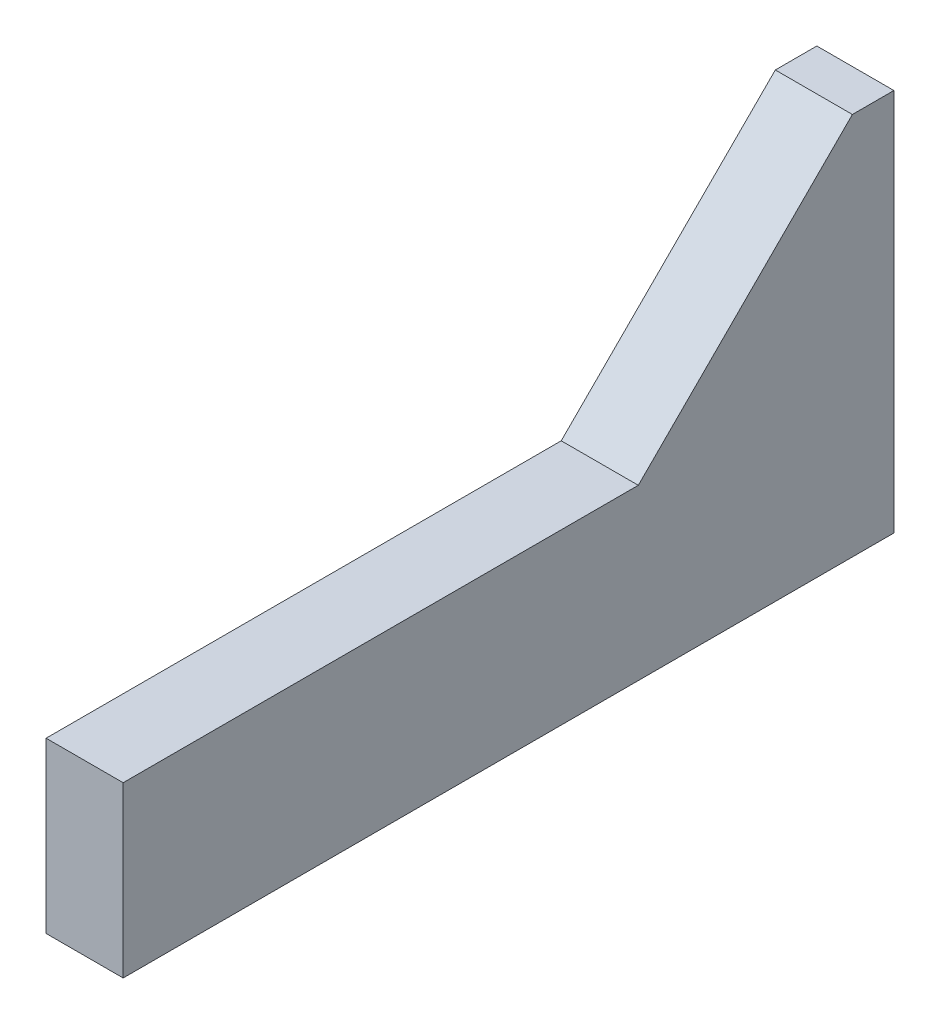
ISO-10303-21;
HEADER;
FILE_DESCRIPTION(('STEP AP214'),'2;1');
FILE_NAME('part.step','',(''),(''),'','','');
FILE_SCHEMA(('AUTOMOTIVE_DESIGN { 1 0 10303 214 1 1 1 1 }'));
ENDSEC;
DATA;
#1=APPLICATION_CONTEXT('core data for automotive mechanical design processes');
#2=APPLICATION_PROTOCOL_DEFINITION('international standard','automotive_design',2000,#1);
#3=PRODUCT_CONTEXT('',#1,'mechanical');
#4=PRODUCT('Part','Part','',(#3));
#5=PRODUCT_RELATED_PRODUCT_CATEGORY('part','',(#4));
#6=PRODUCT_DEFINITION_FORMATION('','',#4);
#7=PRODUCT_DEFINITION_CONTEXT('part definition',#1,'design');
#8=PRODUCT_DEFINITION('design','',#6,#7);
#9=PRODUCT_DEFINITION_SHAPE('','',#8);
#10=(LENGTH_UNIT() NAMED_UNIT(*) SI_UNIT(.MILLI.,.METRE.));
#11=(NAMED_UNIT(*) PLANE_ANGLE_UNIT() SI_UNIT($,.RADIAN.));
#12=(NAMED_UNIT(*) SI_UNIT($,.STERADIAN.) SOLID_ANGLE_UNIT());
#13=UNCERTAINTY_MEASURE_WITH_UNIT(LENGTH_MEASURE(1.E-05),#10,'distance_accuracy_value','');
#14=(GEOMETRIC_REPRESENTATION_CONTEXT(3) GLOBAL_UNCERTAINTY_ASSIGNED_CONTEXT((#13)) GLOBAL_UNIT_ASSIGNED_CONTEXT((#10,
#11,#12)) REPRESENTATION_CONTEXT('',''));
#15=CARTESIAN_POINT('',(0.,0.,0.));
#16=DIRECTION('',(0.,0.,1.));
#17=DIRECTION('',(1.,0.,0.));
#18=AXIS2_PLACEMENT_3D('',#15,#16,#17);
#19=CARTESIAN_POINT('',(-9.,12.25,90.));
#20=DIRECTION('',(0.,1.,0.));
#21=DIRECTION('',(0.,0.,1.));
#22=AXIS2_PLACEMENT_3D('',#19,#20,#21);
#23=PLANE('',#22);
#24=DIRECTION('',(0.,0.,-1.));
#25=VECTOR('',#24,1.);
#26=CARTESIAN_POINT('',(-13.5,12.25,90.));
#27=LINE('',#26,#25);
#28=CARTESIAN_POINT('',(-13.5,12.25,90.));
#29=VERTEX_POINT('',#28);
#30=CARTESIAN_POINT('',(-13.5,12.25,29.8478534301178));
#31=VERTEX_POINT('',#30);
#32=EDGE_CURVE('E164',#29,#31,#27,.T.);
#33=ORIENTED_EDGE('',*,*,#32,.F.);
#34=DIRECTION('',(-1.,0.,0.));
#35=VECTOR('',#34,1.);
#36=CARTESIAN_POINT('',(-9.,12.25,90.));
#37=LINE('',#36,#35);
#38=CARTESIAN_POINT('',(-4.5,12.25,90.));
#39=VERTEX_POINT('',#38);
#40=EDGE_CURVE('E235',#39,#29,#37,.T.);
#41=ORIENTED_EDGE('',*,*,#40,.F.);
#42=DIRECTION('',(0.,0.,-1.));
#43=VECTOR('',#42,1.);
#44=CARTESIAN_POINT('',(-4.5,12.25,90.));
#45=LINE('',#44,#43);
#46=CARTESIAN_POINT('',(-4.5,12.25,29.8478534301178));
#47=VERTEX_POINT('',#46);
#48=EDGE_CURVE('E160',#39,#47,#45,.T.);
#49=ORIENTED_EDGE('',*,*,#48,.T.);
#50=DIRECTION('',(1.,0.,0.));
#51=VECTOR('',#50,1.);
#52=CARTESIAN_POINT('',(-52.4344879815543,12.25,29.8478534301178));
#53=LINE('',#52,#51);
#54=EDGE_CURVE('E288',#31,#47,#53,.T.);
#55=ORIENTED_EDGE('',*,*,#54,.F.);
#56=EDGE_LOOP('',(#33,#41,#49,#55));
#57=FACE_BOUND('',#56,.T.);
#58=ADVANCED_FACE('F38',(#57),#23,.T.);
#59=CARTESIAN_POINT('',(-9.,-7.5,90.));
#60=DIRECTION('',(0.,1.,0.));
#61=DIRECTION('',(0.,0.,1.));
#62=AXIS2_PLACEMENT_3D('',#59,#60,#61);
#63=PLANE('',#62);
#64=CARTESIAN_POINT('',(-9.,-7.5,22.5));
#65=DIRECTION('',(0.,1.,0.));
#66=DIRECTION('',(0.,0.,-1.));
#67=AXIS2_PLACEMENT_3D('',#64,#65,#66);
#68=CIRCLE('',#67,2.1);
#69=CARTESIAN_POINT('',(-9.,-7.5,20.4));
#70=VERTEX_POINT('',#69);
#71=EDGE_CURVE('E220',#70,#70,#68,.T.);
#72=ORIENTED_EDGE('',*,*,#71,.T.);
#73=EDGE_LOOP('',(#72));
#74=FACE_BOUND('',#73,.T.);
#75=CARTESIAN_POINT('',(-9.,-7.5,67.5));
#76=DIRECTION('',(0.,1.,0.));
#77=DIRECTION('',(0.,0.,-1.));
#78=AXIS2_PLACEMENT_3D('',#75,#76,#77);
#79=CIRCLE('',#78,2.1);
#80=CARTESIAN_POINT('',(-9.,-7.5,65.4));
#81=VERTEX_POINT('',#80);
#82=EDGE_CURVE('E226',#81,#81,#79,.T.);
#83=ORIENTED_EDGE('',*,*,#82,.T.);
#84=EDGE_LOOP('',(#83));
#85=FACE_BOUND('',#84,.T.);
#86=CARTESIAN_POINT('',(-9.,-7.5,45.));
#87=DIRECTION('',(0.,1.,0.));
#88=DIRECTION('',(0.,0.,-1.));
#89=AXIS2_PLACEMENT_3D('',#86,#87,#88);
#90=CIRCLE('',#89,2.1);
#91=CARTESIAN_POINT('',(-9.,-7.5,42.9));
#92=VERTEX_POINT('',#91);
#93=EDGE_CURVE('E215',#92,#92,#90,.T.);
#94=ORIENTED_EDGE('',*,*,#93,.T.);
#95=EDGE_LOOP('',(#94));
#96=FACE_BOUND('',#95,.T.);
#97=DIRECTION('',(-1.,0.,0.));
#98=VECTOR('',#97,1.);
#99=CARTESIAN_POINT('',(-9.,-7.5,0.));
#100=LINE('',#99,#98);
#101=CARTESIAN_POINT('',(-4.5,-7.5,0.));
#102=VERTEX_POINT('',#101);
#103=CARTESIAN_POINT('',(-13.5,-7.5,0.));
#104=VERTEX_POINT('',#103);
#105=EDGE_CURVE('E219',#102,#104,#100,.T.);
#106=ORIENTED_EDGE('',*,*,#105,.F.);
#107=DIRECTION('',(0.,0.,-1.));
#108=VECTOR('',#107,1.);
#109=CARTESIAN_POINT('',(-4.5,-7.5,90.));
#110=LINE('',#109,#108);
#111=CARTESIAN_POINT('',(-4.5,-7.5,90.));
#112=VERTEX_POINT('',#111);
#113=EDGE_CURVE('E148',#112,#102,#110,.T.);
#114=ORIENTED_EDGE('',*,*,#113,.F.);
#115=DIRECTION('',(-1.,0.,0.));
#116=VECTOR('',#115,1.);
#117=CARTESIAN_POINT('',(-9.,-7.5,90.));
#118=LINE('',#117,#116);
#119=CARTESIAN_POINT('',(-13.5,-7.5,90.));
#120=VERTEX_POINT('',#119);
#121=EDGE_CURVE('E150',#112,#120,#118,.T.);
#122=ORIENTED_EDGE('',*,*,#121,.T.);
#123=DIRECTION('',(0.,0.,-1.));
#124=VECTOR('',#123,1.);
#125=CARTESIAN_POINT('',(-13.5,-7.5,90.));
#126=LINE('',#125,#124);
#127=EDGE_CURVE('E173',#120,#104,#126,.T.);
#128=ORIENTED_EDGE('',*,*,#127,.T.);
#129=EDGE_LOOP('',(#106,#114,#122,#128));
#130=FACE_BOUND('',#129,.T.);
#131=ADVANCED_FACE('F261',(#74,#85,#96,#130),#63,.F.);
#132=CARTESIAN_POINT('',(-9.,7.5,90.));
#133=DIRECTION('',(0.,1.,0.));
#134=DIRECTION('',(0.,0.,1.));
#135=AXIS2_PLACEMENT_3D('',#132,#133,#134);
#136=PLANE('',#135);
#137=DIRECTION('',(1.,0.,0.));
#138=VECTOR('',#137,1.);
#139=CARTESIAN_POINT('',(-13.5,7.5,87.));
#140=LINE('',#139,#138);
#141=CARTESIAN_POINT('',(-12.75,7.5,87.));
#142=VERTEX_POINT('',#141);
#143=CARTESIAN_POINT('',(-8.5,7.5,87.));
#144=VERTEX_POINT('',#143);
#145=EDGE_CURVE('E200',#142,#144,#140,.T.);
#146=ORIENTED_EDGE('',*,*,#145,.T.);
#147=DIRECTION('',(0.,0.,-1.));
#148=VECTOR('',#147,1.);
#149=CARTESIAN_POINT('',(-8.5,7.5,90.));
#150=LINE('',#149,#148);
#151=CARTESIAN_POINT('',(-8.5,7.5,0.));
#152=VERTEX_POINT('',#151);
#153=EDGE_CURVE('E170',#144,#152,#150,.T.);
#154=ORIENTED_EDGE('',*,*,#153,.T.);
#155=DIRECTION('',(-1.,0.,0.));
#156=VECTOR('',#155,1.);
#157=CARTESIAN_POINT('',(-9.,7.5,0.));
#158=LINE('',#157,#156);
#159=CARTESIAN_POINT('',(-12.75,7.5,0.));
#160=VERTEX_POINT('',#159);
#161=EDGE_CURVE('E201',#152,#160,#158,.T.);
#162=ORIENTED_EDGE('',*,*,#161,.T.);
#163=DIRECTION('',(0.,0.,-1.));
#164=VECTOR('',#163,1.);
#165=CARTESIAN_POINT('',(-12.75,7.5,0.));
#166=LINE('',#165,#164);
#167=EDGE_CURVE('E176',#142,#160,#166,.T.);
#168=ORIENTED_EDGE('',*,*,#167,.F.);
#169=EDGE_LOOP('',(#146,#154,#162,#168));
#170=FACE_BOUND('',#169,.T.);
#171=ADVANCED_FACE('F199',(#170),#136,.T.);
#172=CARTESIAN_POINT('',(-8.5,0.,90.));
#173=DIRECTION('',(1.,0.,0.));
#174=DIRECTION('',(0.,0.,1.));
#175=AXIS2_PLACEMENT_3D('',#172,#173,#174);
#176=PLANE('',#175);
#177=DIRECTION('',(0.,0.,-1.));
#178=VECTOR('',#177,1.);
#179=CARTESIAN_POINT('',(-8.5,9.75,90.));
#180=LINE('',#179,#178);
#181=CARTESIAN_POINT('',(-8.5,9.75,87.));
#182=VERTEX_POINT('',#181);
#183=CARTESIAN_POINT('',(-8.5,9.75,0.));
#184=VERTEX_POINT('',#183);
#185=EDGE_CURVE('E167',#182,#184,#180,.T.);
#186=ORIENTED_EDGE('',*,*,#185,.T.);
#187=DIRECTION('',(0.,1.,0.));
#188=VECTOR('',#187,1.);
#189=CARTESIAN_POINT('',(-8.5,0.,0.));
#190=LINE('',#189,#188);
#191=EDGE_CURVE('E244',#152,#184,#190,.T.);
#192=ORIENTED_EDGE('',*,*,#191,.F.);
#193=ORIENTED_EDGE('',*,*,#153,.F.);
#194=DIRECTION('',(0.,1.,0.));
#195=VECTOR('',#194,1.);
#196=CARTESIAN_POINT('',(-8.5,9.75,87.));
#197=LINE('',#196,#195);
#198=EDGE_CURVE('E204',#144,#182,#197,.T.);
#199=ORIENTED_EDGE('',*,*,#198,.T.);
#200=EDGE_LOOP('',(#186,#192,#193,#199));
#201=FACE_BOUND('',#200,.T.);
#202=ADVANCED_FACE('F252',(#201),#176,.F.);
#203=CARTESIAN_POINT('',(-8.99999999999999,9.75,90.));
#204=DIRECTION('',(0.,-1.,0.));
#205=DIRECTION('',(-1.,0.,0.));
#206=AXIS2_PLACEMENT_3D('',#203,#204,#205);
#207=PLANE('',#206);
#208=DIRECTION('',(1.,0.,0.));
#209=VECTOR('',#208,1.);
#210=CARTESIAN_POINT('',(-8.99999999999999,9.75,0.));
#211=LINE('',#210,#209);
#212=CARTESIAN_POINT('',(-12.75,9.75,0.));
#213=VERTEX_POINT('',#212);
#214=EDGE_CURVE('E155',#213,#184,#211,.T.);
#215=ORIENTED_EDGE('',*,*,#214,.T.);
#216=ORIENTED_EDGE('',*,*,#185,.F.);
#217=DIRECTION('',(-1.,0.,0.));
#218=VECTOR('',#217,1.);
#219=CARTESIAN_POINT('',(-13.5,9.75,87.));
#220=LINE('',#219,#218);
#221=CARTESIAN_POINT('',(-12.75,9.75,87.));
#222=VERTEX_POINT('',#221);
#223=EDGE_CURVE('E208',#182,#222,#220,.T.);
#224=ORIENTED_EDGE('',*,*,#223,.T.);
#225=DIRECTION('',(0.,0.,1.));
#226=VECTOR('',#225,1.);
#227=CARTESIAN_POINT('',(-12.75,9.75,87.));
#228=LINE('',#227,#226);
#229=EDGE_CURVE('E189',#213,#222,#228,.T.);
#230=ORIENTED_EDGE('',*,*,#229,.F.);
#231=EDGE_LOOP('',(#215,#216,#224,#230));
#232=FACE_BOUND('',#231,.T.);
#233=ADVANCED_FACE('F250',(#232),#207,.T.);
#234=CARTESIAN_POINT('',(-13.5,0.,90.));
#235=DIRECTION('',(1.,0.,0.));
#236=DIRECTION('',(0.,0.,1.));
#237=AXIS2_PLACEMENT_3D('',#234,#235,#236);
#238=PLANE('',#237);
#239=DIRECTION('',(0.,1.,0.));
#240=VECTOR('',#239,1.);
#241=CARTESIAN_POINT('',(-13.5,0.,0.));
#242=LINE('',#241,#240);
#243=CARTESIAN_POINT('',(-13.5,6.74999999999999,0.));
#244=VERTEX_POINT('',#243);
#245=EDGE_CURVE('E240',#104,#244,#242,.T.);
#246=ORIENTED_EDGE('',*,*,#245,.F.);
#247=ORIENTED_EDGE('',*,*,#127,.F.);
#248=DIRECTION('',(0.,1.,0.));
#249=VECTOR('',#248,1.);
#250=CARTESIAN_POINT('',(-13.5,0.,90.));
#251=LINE('',#250,#249);
#252=EDGE_CURVE('E153',#120,#29,#251,.T.);
#253=ORIENTED_EDGE('',*,*,#252,.T.);
#254=ORIENTED_EDGE('',*,*,#32,.T.);
#255=DIRECTION('',(0.,0.707106781186539,-0.707106781186556));
#256=VECTOR('',#255,1.);
#257=CARTESIAN_POINT('',(-13.5,37.25,4.84785343011713));
#258=LINE('',#257,#256);
#259=CARTESIAN_POINT('',(-13.5,37.25,4.84785343011713));
#260=VERTEX_POINT('',#259);
#261=EDGE_CURVE('E139',#31,#260,#258,.T.);
#262=ORIENTED_EDGE('',*,*,#261,.T.);
#263=DIRECTION('',(0.,0.,-1.));
#264=VECTOR('',#263,1.);
#265=CARTESIAN_POINT('',(-13.5,37.25,0.));
#266=LINE('',#265,#264);
#267=CARTESIAN_POINT('',(-13.5,37.25,0.));
#268=VERTEX_POINT('',#267);
#269=EDGE_CURVE('E210',#260,#268,#266,.T.);
#270=ORIENTED_EDGE('',*,*,#269,.T.);
#271=DIRECTION('',(0.,1.,0.));
#272=VECTOR('',#271,1.);
#273=CARTESIAN_POINT('',(-13.5,0.,0.));
#274=LINE('',#273,#272);
#275=CARTESIAN_POINT('',(-13.5,10.5,0.));
#276=VERTEX_POINT('',#275);
#277=EDGE_CURVE('E135',#276,#268,#274,.T.);
#278=ORIENTED_EDGE('',*,*,#277,.F.);
#279=DIRECTION('',(0.,0.,-1.));
#280=VECTOR('',#279,1.);
#281=CARTESIAN_POINT('',(-13.5,10.5,0.));
#282=LINE('',#281,#280);
#283=CARTESIAN_POINT('',(-13.5,10.5,87.));
#284=VERTEX_POINT('',#283);
#285=EDGE_CURVE('E183',#284,#276,#282,.T.);
#286=ORIENTED_EDGE('',*,*,#285,.F.);
#287=DIRECTION('',(0.,-1.,0.));
#288=VECTOR('',#287,1.);
#289=CARTESIAN_POINT('',(-13.5,9.75,87.));
#290=LINE('',#289,#288);
#291=CARTESIAN_POINT('',(-13.5,6.74999999999999,87.));
#292=VERTEX_POINT('',#291);
#293=EDGE_CURVE('E206',#284,#292,#290,.T.);
#294=ORIENTED_EDGE('',*,*,#293,.T.);
#295=DIRECTION('',(0.,0.,1.));
#296=VECTOR('',#295,1.);
#297=CARTESIAN_POINT('',(-13.5,6.74999999999999,87.));
#298=LINE('',#297,#296);
#299=EDGE_CURVE('E186',#244,#292,#298,.T.);
#300=ORIENTED_EDGE('',*,*,#299,.F.);
#301=EDGE_LOOP('',(#246,#247,#253,#254,#262,#270,#278,#286,#294,#300));
#302=FACE_BOUND('',#301,.T.);
#303=ADVANCED_FACE('F259',(#302),#238,.F.);
#304=CARTESIAN_POINT('',(-4.5,0.,90.));
#305=DIRECTION('',(1.,0.,0.));
#306=DIRECTION('',(0.,0.,1.));
#307=AXIS2_PLACEMENT_3D('',#304,#305,#306);
#308=PLANE('',#307);
#309=DIRECTION('',(0.,1.,0.));
#310=VECTOR('',#309,1.);
#311=CARTESIAN_POINT('',(-4.5,0.,0.));
#312=LINE('',#311,#310);
#313=CARTESIAN_POINT('',(-4.5,37.25,0.));
#314=VERTEX_POINT('',#313);
#315=EDGE_CURVE('E132',#102,#314,#312,.T.);
#316=ORIENTED_EDGE('',*,*,#315,.T.);
#317=DIRECTION('',(0.,0.,1.));
#318=VECTOR('',#317,1.);
#319=CARTESIAN_POINT('',(-4.5,37.25,0.));
#320=LINE('',#319,#318);
#321=CARTESIAN_POINT('',(-4.5,37.25,4.84785343011713));
#322=VERTEX_POINT('',#321);
#323=EDGE_CURVE('E142',#314,#322,#320,.T.);
#324=ORIENTED_EDGE('',*,*,#323,.T.);
#325=DIRECTION('',(0.,-0.707106781186538,0.707106781186556));
#326=VECTOR('',#325,1.);
#327=CARTESIAN_POINT('',(-4.5,37.25,4.84785343011713));
#328=LINE('',#327,#326);
#329=EDGE_CURVE('E53',#322,#47,#328,.T.);
#330=ORIENTED_EDGE('',*,*,#329,.T.);
#331=ORIENTED_EDGE('',*,*,#48,.F.);
#332=DIRECTION('',(0.,1.,0.));
#333=VECTOR('',#332,1.);
#334=CARTESIAN_POINT('',(-4.5,0.,90.));
#335=LINE('',#334,#333);
#336=EDGE_CURVE('E161',#112,#39,#335,.T.);
#337=ORIENTED_EDGE('',*,*,#336,.F.);
#338=ORIENTED_EDGE('',*,*,#113,.T.);
#339=EDGE_LOOP('',(#316,#324,#330,#331,#337,#338));
#340=FACE_BOUND('',#339,.T.);
#341=ADVANCED_FACE('F146',(#340),#308,.T.);
#342=CARTESIAN_POINT('',(-9.,0.,90.));
#343=DIRECTION('',(0.,0.,1.));
#344=DIRECTION('',(-1.,0.,0.));
#345=AXIS2_PLACEMENT_3D('',#342,#343,#344);
#346=PLANE('',#345);
#347=ORIENTED_EDGE('',*,*,#252,.F.);
#348=ORIENTED_EDGE('',*,*,#121,.F.);
#349=ORIENTED_EDGE('',*,*,#336,.T.);
#350=ORIENTED_EDGE('',*,*,#40,.T.);
#351=EDGE_LOOP('',(#347,#348,#349,#350));
#352=FACE_BOUND('',#351,.T.);
#353=ADVANCED_FACE('F280',(#352),#346,.T.);
#354=CARTESIAN_POINT('',(-9.,0.,0.));
#355=DIRECTION('',(0.,0.,1.));
#356=DIRECTION('',(-1.,0.,0.));
#357=AXIS2_PLACEMENT_3D('',#354,#355,#356);
#358=PLANE('',#357);
#359=CARTESIAN_POINT('',(-9.,2.5,0.));
#360=DIRECTION('',(0.,0.,1.));
#361=DIRECTION('',(1.,0.,0.));
#362=AXIS2_PLACEMENT_3D('',#359,#360,#361);
#363=CIRCLE('',#362,2.1);
#364=CARTESIAN_POINT('',(-6.9,2.5,0.));
#365=VERTEX_POINT('',#364);
#366=EDGE_CURVE('E302',#365,#365,#363,.T.);
#367=ORIENTED_EDGE('',*,*,#366,.T.);
#368=EDGE_LOOP('',(#367));
#369=FACE_BOUND('',#368,.T.);
#370=CARTESIAN_POINT('',(-9.,27.25,0.));
#371=DIRECTION('',(0.,0.,1.));
#372=DIRECTION('',(1.,0.,0.));
#373=AXIS2_PLACEMENT_3D('',#370,#371,#372);
#374=CIRCLE('',#373,2.1);
#375=CARTESIAN_POINT('',(-6.9,27.25,0.));
#376=VERTEX_POINT('',#375);
#377=EDGE_CURVE('E296',#376,#376,#374,.T.);
#378=ORIENTED_EDGE('',*,*,#377,.T.);
#379=EDGE_LOOP('',(#378));
#380=FACE_BOUND('',#379,.T.);
#381=ORIENTED_EDGE('',*,*,#161,.F.);
#382=ORIENTED_EDGE('',*,*,#191,.T.);
#383=ORIENTED_EDGE('',*,*,#214,.F.);
#384=DIRECTION('',(0.707106781186552,-0.707106781186543,0.));
#385=VECTOR('',#384,1.);
#386=CARTESIAN_POINT('',(-13.5,10.5,0.));
#387=LINE('',#386,#385);
#388=EDGE_CURVE('E179',#276,#213,#387,.T.);
#389=ORIENTED_EDGE('',*,*,#388,.F.);
#390=ORIENTED_EDGE('',*,*,#277,.T.);
#391=DIRECTION('',(1.,0.,0.));
#392=VECTOR('',#391,1.);
#393=CARTESIAN_POINT('',(-52.4344879815543,37.25,0.));
#394=LINE('',#393,#392);
#395=EDGE_CURVE('E126',#268,#314,#394,.T.);
#396=ORIENTED_EDGE('',*,*,#395,.T.);
#397=ORIENTED_EDGE('',*,*,#315,.F.);
#398=ORIENTED_EDGE('',*,*,#105,.T.);
#399=ORIENTED_EDGE('',*,*,#245,.T.);
#400=DIRECTION('',(-0.707106781186544,-0.707106781186551,0.));
#401=VECTOR('',#400,1.);
#402=CARTESIAN_POINT('',(-12.75,7.5,0.));
#403=LINE('',#402,#401);
#404=EDGE_CURVE('E181',#160,#244,#403,.T.);
#405=ORIENTED_EDGE('',*,*,#404,.F.);
#406=EDGE_LOOP('',(#381,#382,#383,#389,#390,#396,#397,#398,#399,#405));
#407=FACE_BOUND('',#406,.T.);
#408=ADVANCED_FACE('F129',(#369,#380,#407),#358,.F.);
#409=CARTESIAN_POINT('',(-9.,-1.5,45.));
#410=DIRECTION('',(0.,-1.,0.));
#411=DIRECTION('',(0.,0.,-1.));
#412=AXIS2_PLACEMENT_3D('',#409,#410,#411);
#413=CYLINDRICAL_SURFACE('',#412,2.1);
#414=CARTESIAN_POINT('',(-9.,-1.5,45.));
#415=DIRECTION('',(0.,1.,0.));
#416=DIRECTION('',(0.,0.,-1.));
#417=AXIS2_PLACEMENT_3D('',#414,#415,#416);
#418=CIRCLE('',#417,2.1);
#419=CARTESIAN_POINT('',(-9.,-1.5,42.9));
#420=VERTEX_POINT('',#419);
#421=EDGE_CURVE('E229',#420,#420,#418,.T.);
#422=ORIENTED_EDGE('',*,*,#421,.T.);
#423=EDGE_LOOP('',(#422));
#424=FACE_BOUND('',#423,.T.);
#425=ORIENTED_EDGE('',*,*,#93,.F.);
#426=EDGE_LOOP('',(#425));
#427=FACE_BOUND('',#426,.T.);
#428=ADVANCED_FACE('F353',(#424,#427),#413,.F.);
#429=CARTESIAN_POINT('',(-9.,-1.5,45.));
#430=DIRECTION('',(0.,-1.,0.));
#431=DIRECTION('',(0.,0.,-1.));
#432=AXIS2_PLACEMENT_3D('',#429,#430,#431);
#433=PLANE('',#432);
#434=ORIENTED_EDGE('',*,*,#421,.F.);
#435=EDGE_LOOP('',(#434));
#436=FACE_BOUND('',#435,.T.);
#437=ADVANCED_FACE('F349',(#436),#433,.T.);
#438=CARTESIAN_POINT('',(-9.,-1.5,67.5));
#439=DIRECTION('',(0.,-1.,0.));
#440=DIRECTION('',(0.,0.,-1.));
#441=AXIS2_PLACEMENT_3D('',#438,#439,#440);
#442=CYLINDRICAL_SURFACE('',#441,2.1);
#443=CARTESIAN_POINT('',(-9.,-1.5,67.5));
#444=DIRECTION('',(0.,1.,0.));
#445=DIRECTION('',(0.,0.,-1.));
#446=AXIS2_PLACEMENT_3D('',#443,#444,#445);
#447=CIRCLE('',#446,2.1);
#448=CARTESIAN_POINT('',(-9.,-1.5,65.4));
#449=VERTEX_POINT('',#448);
#450=EDGE_CURVE('E223',#449,#449,#447,.T.);
#451=ORIENTED_EDGE('',*,*,#450,.T.);
#452=EDGE_LOOP('',(#451));
#453=FACE_BOUND('',#452,.T.);
#454=ORIENTED_EDGE('',*,*,#82,.F.);
#455=EDGE_LOOP('',(#454));
#456=FACE_BOUND('',#455,.T.);
#457=ADVANCED_FACE('F345',(#453,#456),#442,.F.);
#458=CARTESIAN_POINT('',(-9.,-1.5,67.5));
#459=DIRECTION('',(0.,-1.,0.));
#460=DIRECTION('',(0.,0.,-1.));
#461=AXIS2_PLACEMENT_3D('',#458,#459,#460);
#462=PLANE('',#461);
#463=ORIENTED_EDGE('',*,*,#450,.F.);
#464=EDGE_LOOP('',(#463));
#465=FACE_BOUND('',#464,.T.);
#466=ADVANCED_FACE('F341',(#465),#462,.T.);
#467=CARTESIAN_POINT('',(-9.,-1.5,22.5));
#468=DIRECTION('',(0.,-1.,0.));
#469=DIRECTION('',(0.,0.,-1.));
#470=AXIS2_PLACEMENT_3D('',#467,#468,#469);
#471=CYLINDRICAL_SURFACE('',#470,2.1);
#472=CARTESIAN_POINT('',(-9.,-1.5,22.5));
#473=DIRECTION('',(0.,1.,0.));
#474=DIRECTION('',(0.,0.,-1.));
#475=AXIS2_PLACEMENT_3D('',#472,#473,#474);
#476=CIRCLE('',#475,2.1);
#477=CARTESIAN_POINT('',(-9.,-1.5,20.4));
#478=VERTEX_POINT('',#477);
#479=EDGE_CURVE('E216',#478,#478,#476,.T.);
#480=ORIENTED_EDGE('',*,*,#479,.T.);
#481=EDGE_LOOP('',(#480));
#482=FACE_BOUND('',#481,.T.);
#483=ORIENTED_EDGE('',*,*,#71,.F.);
#484=EDGE_LOOP('',(#483));
#485=FACE_BOUND('',#484,.T.);
#486=ADVANCED_FACE('F337',(#482,#485),#471,.F.);
#487=CARTESIAN_POINT('',(-9.,-1.5,22.5));
#488=DIRECTION('',(0.,-1.,0.));
#489=DIRECTION('',(0.,0.,-1.));
#490=AXIS2_PLACEMENT_3D('',#487,#488,#489);
#491=PLANE('',#490);
#492=ORIENTED_EDGE('',*,*,#479,.F.);
#493=EDGE_LOOP('',(#492));
#494=FACE_BOUND('',#493,.T.);
#495=ADVANCED_FACE('F334',(#494),#491,.T.);
#496=CARTESIAN_POINT('',(-9.,0.,87.));
#497=DIRECTION('',(0.,0.,-1.));
#498=DIRECTION('',(1.,0.,0.));
#499=AXIS2_PLACEMENT_3D('',#496,#497,#498);
#500=PLANE('',#499);
#501=ORIENTED_EDGE('',*,*,#293,.F.);
#502=DIRECTION('',(-0.707106781186552,0.707106781186543,0.));
#503=VECTOR('',#502,1.);
#504=CARTESIAN_POINT('',(-13.5,10.5,87.));
#505=LINE('',#504,#503);
#506=EDGE_CURVE('E11',#222,#284,#505,.T.);
#507=ORIENTED_EDGE('',*,*,#506,.F.);
#508=ORIENTED_EDGE('',*,*,#223,.F.);
#509=ORIENTED_EDGE('',*,*,#198,.F.);
#510=ORIENTED_EDGE('',*,*,#145,.F.);
#511=DIRECTION('',(0.707106781186544,0.707106781186551,0.));
#512=VECTOR('',#511,1.);
#513=CARTESIAN_POINT('',(-12.75,7.5,87.));
#514=LINE('',#513,#512);
#515=EDGE_CURVE('E46',#292,#142,#514,.T.);
#516=ORIENTED_EDGE('',*,*,#515,.F.);
#517=EDGE_LOOP('',(#501,#507,#508,#509,#510,#516));
#518=FACE_BOUND('',#517,.T.);
#519=ADVANCED_FACE('F202',(#518),#500,.T.);
#520=CARTESIAN_POINT('',(-12.75,7.5,90.));
#521=DIRECTION('',(-0.707106781186551,0.707106781186544,0.));
#522=DIRECTION('',(0.,0.,1.));
#523=AXIS2_PLACEMENT_3D('',#520,#521,#522);
#524=PLANE('',#523);
#525=ORIENTED_EDGE('',*,*,#515,.T.);
#526=ORIENTED_EDGE('',*,*,#167,.T.);
#527=ORIENTED_EDGE('',*,*,#404,.T.);
#528=ORIENTED_EDGE('',*,*,#299,.T.);
#529=EDGE_LOOP('',(#525,#526,#527,#528));
#530=FACE_BOUND('',#529,.T.);
#531=ADVANCED_FACE('F192',(#530),#524,.T.);
#532=CARTESIAN_POINT('',(-13.5,10.5,90.));
#533=DIRECTION('',(-0.707106781186543,-0.707106781186552,0.));
#534=DIRECTION('',(0.,0.,1.));
#535=AXIS2_PLACEMENT_3D('',#532,#533,#534);
#536=PLANE('',#535);
#537=ORIENTED_EDGE('',*,*,#506,.T.);
#538=ORIENTED_EDGE('',*,*,#285,.T.);
#539=ORIENTED_EDGE('',*,*,#388,.T.);
#540=ORIENTED_EDGE('',*,*,#229,.T.);
#541=EDGE_LOOP('',(#537,#538,#539,#540));
#542=FACE_BOUND('',#541,.T.);
#543=ADVANCED_FACE('F40',(#542),#536,.T.);
#544=CARTESIAN_POINT('',(-52.4344879815543,37.25,0.));
#545=DIRECTION('',(0.,-1.,0.));
#546=DIRECTION('',(0.,0.,-1.));
#547=AXIS2_PLACEMENT_3D('',#544,#545,#546);
#548=PLANE('',#547);
#549=DIRECTION('',(1.,0.,0.));
#550=VECTOR('',#549,1.);
#551=CARTESIAN_POINT('',(-52.4344879815543,37.25,4.84785343011713));
#552=LINE('',#551,#550);
#553=EDGE_CURVE('E140',#260,#322,#552,.T.);
#554=ORIENTED_EDGE('',*,*,#553,.T.);
#555=ORIENTED_EDGE('',*,*,#323,.F.);
#556=ORIENTED_EDGE('',*,*,#395,.F.);
#557=ORIENTED_EDGE('',*,*,#269,.F.);
#558=EDGE_LOOP('',(#554,#555,#556,#557));
#559=FACE_BOUND('',#558,.T.);
#560=ADVANCED_FACE('F143',(#559),#548,.F.);
#561=CARTESIAN_POINT('',(-52.4344879815543,37.25,4.84785343011713));
#562=DIRECTION('',(0.,-0.707106781186556,-0.707106781186539));
#563=DIRECTION('',(0.,0.707106781186539,-0.707106781186556));
#564=AXIS2_PLACEMENT_3D('',#561,#562,#563);
#565=PLANE('',#564);
#566=ORIENTED_EDGE('',*,*,#54,.T.);
#567=ORIENTED_EDGE('',*,*,#329,.F.);
#568=ORIENTED_EDGE('',*,*,#553,.F.);
#569=ORIENTED_EDGE('',*,*,#261,.F.);
#570=EDGE_LOOP('',(#566,#567,#568,#569));
#571=FACE_BOUND('',#570,.T.);
#572=ADVANCED_FACE('F326',(#571),#565,.F.);
#573=CARTESIAN_POINT('',(-9.,27.25,6.));
#574=DIRECTION('',(0.,0.,-1.));
#575=DIRECTION('',(1.,0.,0.));
#576=AXIS2_PLACEMENT_3D('',#573,#574,#575);
#577=CYLINDRICAL_SURFACE('',#576,2.1);
#578=CARTESIAN_POINT('',(-9.,27.25,6.));
#579=DIRECTION('',(0.,0.,1.));
#580=DIRECTION('',(1.,0.,0.));
#581=AXIS2_PLACEMENT_3D('',#578,#579,#580);
#582=CIRCLE('',#581,2.1);
#583=CARTESIAN_POINT('',(-6.9,27.25,6.));
#584=VERTEX_POINT('',#583);
#585=EDGE_CURVE('E299',#584,#584,#582,.T.);
#586=ORIENTED_EDGE('',*,*,#585,.T.);
#587=EDGE_LOOP('',(#586));
#588=FACE_BOUND('',#587,.T.);
#589=ORIENTED_EDGE('',*,*,#377,.F.);
#590=EDGE_LOOP('',(#589));
#591=FACE_BOUND('',#590,.T.);
#592=ADVANCED_FACE('F322',(#588,#591),#577,.F.);
#593=CARTESIAN_POINT('',(-9.,27.25,6.));
#594=DIRECTION('',(0.,0.,-1.));
#595=DIRECTION('',(1.,0.,0.));
#596=AXIS2_PLACEMENT_3D('',#593,#594,#595);
#597=PLANE('',#596);
#598=ORIENTED_EDGE('',*,*,#585,.F.);
#599=EDGE_LOOP('',(#598));
#600=FACE_BOUND('',#599,.T.);
#601=ADVANCED_FACE('F317',(#600),#597,.T.);
#602=CARTESIAN_POINT('',(-9.,2.5,6.));
#603=DIRECTION('',(0.,0.,-1.));
#604=DIRECTION('',(1.,0.,0.));
#605=AXIS2_PLACEMENT_3D('',#602,#603,#604);
#606=CYLINDRICAL_SURFACE('',#605,2.1);
#607=CARTESIAN_POINT('',(-9.,2.5,6.));
#608=DIRECTION('',(0.,0.,1.));
#609=DIRECTION('',(1.,0.,0.));
#610=AXIS2_PLACEMENT_3D('',#607,#608,#609);
#611=CIRCLE('',#610,2.1);
#612=CARTESIAN_POINT('',(-6.9,2.5,6.));
#613=VERTEX_POINT('',#612);
#614=EDGE_CURVE('E144',#613,#613,#611,.T.);
#615=ORIENTED_EDGE('',*,*,#614,.T.);
#616=EDGE_LOOP('',(#615));
#617=FACE_BOUND('',#616,.T.);
#618=ORIENTED_EDGE('',*,*,#366,.F.);
#619=EDGE_LOOP('',(#618));
#620=FACE_BOUND('',#619,.T.);
#621=ADVANCED_FACE('F308',(#617,#620),#606,.F.);
#622=CARTESIAN_POINT('',(-9.,2.5,6.));
#623=DIRECTION('',(0.,0.,-1.));
#624=DIRECTION('',(1.,0.,0.));
#625=AXIS2_PLACEMENT_3D('',#622,#623,#624);
#626=PLANE('',#625);
#627=ORIENTED_EDGE('',*,*,#614,.F.);
#628=EDGE_LOOP('',(#627));
#629=FACE_BOUND('',#628,.T.);
#630=ADVANCED_FACE('F311',(#629),#626,.T.);
#631=CLOSED_SHELL('',(#58,#131,#171,#202,#233,#303,#341,#353,#408,#428,#437,#457,#466,#486,#495,
#519,#531,#543,#560,#572,#592,#601,#621,#630));
#632=MANIFOLD_SOLID_BREP('B2',#631);
#633=ADVANCED_BREP_SHAPE_REPRESENTATION('',(#18,#632),#14);
#634=SHAPE_DEFINITION_REPRESENTATION(#9,#633);
ENDSEC;
END-ISO-10303-21;
